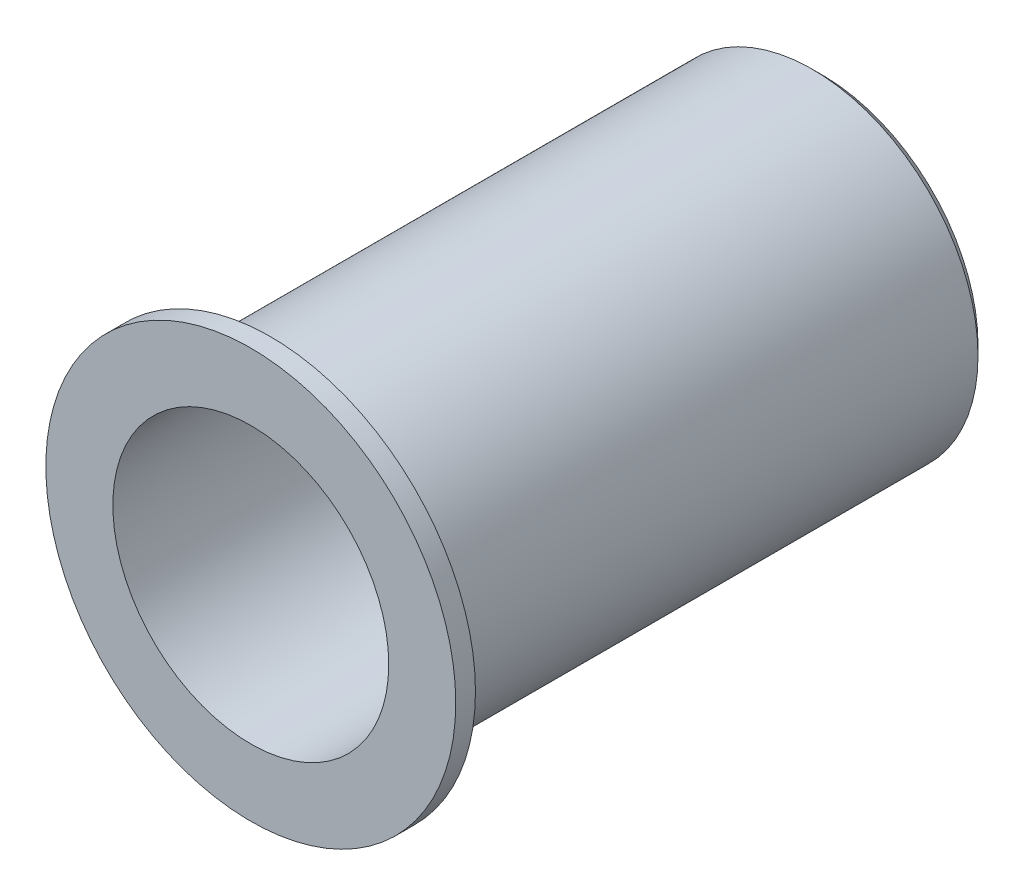
ISO-10303-21;
HEADER;
FILE_DESCRIPTION(('STEP AP214'),'2;1');
FILE_NAME('part.step','',(''),(''),'','','');
FILE_SCHEMA(('AUTOMOTIVE_DESIGN { 1 0 10303 214 1 1 1 1 }'));
ENDSEC;
DATA;
#1=APPLICATION_CONTEXT('core data for automotive mechanical design processes');
#2=APPLICATION_PROTOCOL_DEFINITION('international standard','automotive_design',2000,#1);
#3=PRODUCT_CONTEXT('',#1,'mechanical');
#4=PRODUCT('Part','Part','',(#3));
#5=PRODUCT_RELATED_PRODUCT_CATEGORY('part','',(#4));
#6=PRODUCT_DEFINITION_FORMATION('','',#4);
#7=PRODUCT_DEFINITION_CONTEXT('part definition',#1,'design');
#8=PRODUCT_DEFINITION('design','',#6,#7);
#9=PRODUCT_DEFINITION_SHAPE('','',#8);
#10=(LENGTH_UNIT() NAMED_UNIT(*) SI_UNIT(.MILLI.,.METRE.));
#11=(NAMED_UNIT(*) PLANE_ANGLE_UNIT() SI_UNIT($,.RADIAN.));
#12=(NAMED_UNIT(*) SI_UNIT($,.STERADIAN.) SOLID_ANGLE_UNIT());
#13=UNCERTAINTY_MEASURE_WITH_UNIT(LENGTH_MEASURE(1.E-05),#10,'distance_accuracy_value','');
#14=(GEOMETRIC_REPRESENTATION_CONTEXT(3) GLOBAL_UNCERTAINTY_ASSIGNED_CONTEXT((#13)) GLOBAL_UNIT_ASSIGNED_CONTEXT((#10,
#11,#12)) REPRESENTATION_CONTEXT('',''));
#15=CARTESIAN_POINT('',(0.,0.,0.));
#16=DIRECTION('',(0.,0.,1.));
#17=DIRECTION('',(1.,0.,0.));
#18=AXIS2_PLACEMENT_3D('',#15,#16,#17);
#19=CARTESIAN_POINT('',(0.,0.,28.));
#20=DIRECTION('',(0.,0.,-1.));
#21=DIRECTION('',(-1.,0.,0.));
#22=AXIS2_PLACEMENT_3D('',#19,#20,#21);
#23=CYLINDRICAL_SURFACE('',#22,8.4);
#24=CARTESIAN_POINT('',(0.,0.,0.499999999999997));
#25=DIRECTION('',(0.,0.,1.));
#26=DIRECTION('',(1.,0.,0.));
#27=AXIS2_PLACEMENT_3D('',#24,#25,#26);
#28=CIRCLE('',#27,8.4);
#29=CARTESIAN_POINT('',(8.4,0.,0.499999999999997));
#30=VERTEX_POINT('',#29);
#31=EDGE_CURVE('E48',#30,#30,#28,.T.);
#32=ORIENTED_EDGE('',*,*,#31,.T.);
#33=EDGE_LOOP('',(#32));
#34=FACE_BOUND('',#33,.T.);
#35=CARTESIAN_POINT('',(0.,0.,28.));
#36=DIRECTION('',(0.,0.,1.));
#37=DIRECTION('',(1.,0.,0.));
#38=AXIS2_PLACEMENT_3D('',#35,#36,#37);
#39=CIRCLE('',#38,8.4);
#40=CARTESIAN_POINT('',(8.4,0.,28.));
#41=VERTEX_POINT('',#40);
#42=EDGE_CURVE('E52',#41,#41,#39,.T.);
#43=ORIENTED_EDGE('',*,*,#42,.F.);
#44=EDGE_LOOP('',(#43));
#45=FACE_BOUND('',#44,.T.);
#46=ADVANCED_FACE('F40',(#34,#45),#23,.T.);
#47=CARTESIAN_POINT('',(0.,0.,0.));
#48=DIRECTION('',(0.,0.,1.));
#49=DIRECTION('',(1.,0.,0.));
#50=AXIS2_PLACEMENT_3D('',#47,#48,#49);
#51=PLANE('',#50);
#52=CARTESIAN_POINT('',(0.,0.,0.));
#53=DIRECTION('',(0.,0.,1.));
#54=DIRECTION('',(1.,0.,0.));
#55=AXIS2_PLACEMENT_3D('',#52,#53,#54);
#56=CIRCLE('',#55,7.9);
#57=CARTESIAN_POINT('',(7.9,0.,0.));
#58=VERTEX_POINT('',#57);
#59=EDGE_CURVE('E10',#58,#58,#56,.F.);
#60=ORIENTED_EDGE('',*,*,#59,.T.);
#61=EDGE_LOOP('',(#60));
#62=FACE_BOUND('',#61,.T.);
#63=CARTESIAN_POINT('',(0.,5.,0.));
#64=DIRECTION('',(0.,0.,-1.));
#65=DIRECTION('',(-1.,0.,0.));
#66=AXIS2_PLACEMENT_3D('',#63,#64,#65);
#67=CIRCLE('',#66,1.65);
#68=CARTESIAN_POINT('',(-1.65,5.,0.));
#69=VERTEX_POINT('',#68);
#70=EDGE_CURVE('E63',#69,#69,#67,.T.);
#71=ORIENTED_EDGE('',*,*,#70,.F.);
#72=EDGE_LOOP('',(#71));
#73=FACE_BOUND('',#72,.T.);
#74=CARTESIAN_POINT('',(0.,0.,0.));
#75=DIRECTION('',(0.,0.,-1.));
#76=DIRECTION('',(-1.,0.,0.));
#77=AXIS2_PLACEMENT_3D('',#74,#75,#76);
#78=CIRCLE('',#77,1.65);
#79=CARTESIAN_POINT('',(-1.65,0.,0.));
#80=VERTEX_POINT('',#79);
#81=EDGE_CURVE('E62',#80,#80,#78,.T.);
#82=ORIENTED_EDGE('',*,*,#81,.F.);
#83=EDGE_LOOP('',(#82));
#84=FACE_BOUND('',#83,.T.);
#85=CARTESIAN_POINT('',(4.33012701892166,-2.50000000000031,0.));
#86=DIRECTION('',(0.,0.,-1.));
#87=DIRECTION('',(-1.,0.,0.));
#88=AXIS2_PLACEMENT_3D('',#85,#86,#87);
#89=CIRCLE('',#88,1.65);
#90=CARTESIAN_POINT('',(2.68012701892166,-2.50000000000031,0.));
#91=VERTEX_POINT('',#90);
#92=EDGE_CURVE('E67',#91,#91,#89,.T.);
#93=ORIENTED_EDGE('',*,*,#92,.F.);
#94=EDGE_LOOP('',(#93));
#95=FACE_BOUND('',#94,.T.);
#96=CARTESIAN_POINT('',(-4.33012701892272,-2.49999999999969,0.));
#97=DIRECTION('',(0.,0.,-1.));
#98=DIRECTION('',(-1.,0.,0.));
#99=AXIS2_PLACEMENT_3D('',#96,#97,#98);
#100=CIRCLE('',#99,1.65);
#101=CARTESIAN_POINT('',(-5.98012701892272,-2.49999999999969,0.));
#102=VERTEX_POINT('',#101);
#103=EDGE_CURVE('E71',#102,#102,#100,.T.);
#104=ORIENTED_EDGE('',*,*,#103,.F.);
#105=EDGE_LOOP('',(#104));
#106=FACE_BOUND('',#105,.T.);
#107=ADVANCED_FACE('F116',(#62,#73,#84,#95,#106),#51,.F.);
#108=CARTESIAN_POINT('',(0.,0.,5.));
#109=DIRECTION('',(0.,0.,1.));
#110=DIRECTION('',(1.,0.,0.));
#111=AXIS2_PLACEMENT_3D('',#108,#109,#110);
#112=CYLINDRICAL_SURFACE('',#111,7.);
#113=CARTESIAN_POINT('',(0.,0.,5.));
#114=DIRECTION('',(0.,0.,1.));
#115=DIRECTION('',(1.,0.,0.));
#116=AXIS2_PLACEMENT_3D('',#113,#114,#115);
#117=CIRCLE('',#116,7.);
#118=CARTESIAN_POINT('',(7.,0.,5.));
#119=VERTEX_POINT('',#118);
#120=EDGE_CURVE('E56',#119,#119,#117,.T.);
#121=ORIENTED_EDGE('',*,*,#120,.F.);
#122=EDGE_LOOP('',(#121));
#123=FACE_BOUND('',#122,.T.);
#124=CARTESIAN_POINT('',(0.,0.,29.));
#125=DIRECTION('',(0.,0.,1.));
#126=DIRECTION('',(1.,0.,0.));
#127=AXIS2_PLACEMENT_3D('',#124,#125,#126);
#128=CIRCLE('',#127,7.);
#129=CARTESIAN_POINT('',(7.,0.,29.));
#130=VERTEX_POINT('',#129);
#131=EDGE_CURVE('E85',#130,#130,#128,.F.);
#132=ORIENTED_EDGE('',*,*,#131,.F.);
#133=EDGE_LOOP('',(#132));
#134=FACE_BOUND('',#133,.T.);
#135=ADVANCED_FACE('F120',(#123,#134),#112,.F.);
#136=CARTESIAN_POINT('',(0.,0.,5.));
#137=DIRECTION('',(0.,0.,1.));
#138=DIRECTION('',(1.,0.,0.));
#139=AXIS2_PLACEMENT_3D('',#136,#137,#138);
#140=PLANE('',#139);
#141=CARTESIAN_POINT('',(0.,5.,5.));
#142=DIRECTION('',(0.,0.,1.));
#143=DIRECTION('',(1.,0.,0.));
#144=AXIS2_PLACEMENT_3D('',#141,#142,#143);
#145=CIRCLE('',#144,1.65);
#146=CARTESIAN_POINT('',(1.65,5.,5.));
#147=VERTEX_POINT('',#146);
#148=EDGE_CURVE('E59',#147,#147,#145,.T.);
#149=ORIENTED_EDGE('',*,*,#148,.F.);
#150=EDGE_LOOP('',(#149));
#151=FACE_BOUND('',#150,.T.);
#152=CARTESIAN_POINT('',(0.,0.,5.));
#153=DIRECTION('',(0.,0.,1.));
#154=DIRECTION('',(1.,0.,0.));
#155=AXIS2_PLACEMENT_3D('',#152,#153,#154);
#156=CIRCLE('',#155,1.65);
#157=CARTESIAN_POINT('',(1.65,0.,5.));
#158=VERTEX_POINT('',#157);
#159=EDGE_CURVE('E64',#158,#158,#156,.T.);
#160=ORIENTED_EDGE('',*,*,#159,.F.);
#161=EDGE_LOOP('',(#160));
#162=FACE_BOUND('',#161,.T.);
#163=CARTESIAN_POINT('',(4.33012701892166,-2.50000000000031,5.));
#164=DIRECTION('',(0.,0.,1.));
#165=DIRECTION('',(1.,0.,0.));
#166=AXIS2_PLACEMENT_3D('',#163,#164,#165);
#167=CIRCLE('',#166,1.65);
#168=CARTESIAN_POINT('',(5.98012701892166,-2.50000000000031,5.));
#169=VERTEX_POINT('',#168);
#170=EDGE_CURVE('E68',#169,#169,#167,.T.);
#171=ORIENTED_EDGE('',*,*,#170,.F.);
#172=EDGE_LOOP('',(#171));
#173=FACE_BOUND('',#172,.T.);
#174=CARTESIAN_POINT('',(-4.33012701892272,-2.49999999999969,5.));
#175=DIRECTION('',(0.,0.,1.));
#176=DIRECTION('',(1.,0.,0.));
#177=AXIS2_PLACEMENT_3D('',#174,#175,#176);
#178=CIRCLE('',#177,1.65);
#179=CARTESIAN_POINT('',(-2.68012701892273,-2.49999999999969,5.));
#180=VERTEX_POINT('',#179);
#181=EDGE_CURVE('E72',#180,#180,#178,.T.);
#182=ORIENTED_EDGE('',*,*,#181,.F.);
#183=EDGE_LOOP('',(#182));
#184=FACE_BOUND('',#183,.T.);
#185=ORIENTED_EDGE('',*,*,#120,.T.);
#186=EDGE_LOOP('',(#185));
#187=FACE_BOUND('',#186,.T.);
#188=ADVANCED_FACE('F126',(#151,#162,#173,#184,#187),#140,.T.);
#189=CARTESIAN_POINT('',(-4.33012701892272,-2.49999999999969,0.));
#190=DIRECTION('',(0.,0.,-1.));
#191=DIRECTION('',(-1.,0.,0.));
#192=AXIS2_PLACEMENT_3D('',#189,#190,#191);
#193=CYLINDRICAL_SURFACE('',#192,1.65);
#194=ORIENTED_EDGE('',*,*,#181,.T.);
#195=EDGE_LOOP('',(#194));
#196=FACE_BOUND('',#195,.T.);
#197=ORIENTED_EDGE('',*,*,#103,.T.);
#198=EDGE_LOOP('',(#197));
#199=FACE_BOUND('',#198,.T.);
#200=ADVANCED_FACE('F130',(#196,#199),#193,.F.);
#201=CARTESIAN_POINT('',(4.33012701892166,-2.50000000000031,0.));
#202=DIRECTION('',(0.,0.,-1.));
#203=DIRECTION('',(-1.,0.,0.));
#204=AXIS2_PLACEMENT_3D('',#201,#202,#203);
#205=CYLINDRICAL_SURFACE('',#204,1.65);
#206=ORIENTED_EDGE('',*,*,#170,.T.);
#207=EDGE_LOOP('',(#206));
#208=FACE_BOUND('',#207,.T.);
#209=ORIENTED_EDGE('',*,*,#92,.T.);
#210=EDGE_LOOP('',(#209));
#211=FACE_BOUND('',#210,.T.);
#212=ADVANCED_FACE('F134',(#208,#211),#205,.F.);
#213=CARTESIAN_POINT('',(0.,0.,0.));
#214=DIRECTION('',(0.,0.,-1.));
#215=DIRECTION('',(-1.,0.,0.));
#216=AXIS2_PLACEMENT_3D('',#213,#214,#215);
#217=CYLINDRICAL_SURFACE('',#216,1.65);
#218=ORIENTED_EDGE('',*,*,#159,.T.);
#219=EDGE_LOOP('',(#218));
#220=FACE_BOUND('',#219,.T.);
#221=ORIENTED_EDGE('',*,*,#81,.T.);
#222=EDGE_LOOP('',(#221));
#223=FACE_BOUND('',#222,.T.);
#224=ADVANCED_FACE('F138',(#220,#223),#217,.F.);
#225=CARTESIAN_POINT('',(0.,5.,0.));
#226=DIRECTION('',(0.,0.,-1.));
#227=DIRECTION('',(-1.,0.,0.));
#228=AXIS2_PLACEMENT_3D('',#225,#226,#227);
#229=CYLINDRICAL_SURFACE('',#228,1.65);
#230=ORIENTED_EDGE('',*,*,#148,.T.);
#231=EDGE_LOOP('',(#230));
#232=FACE_BOUND('',#231,.T.);
#233=ORIENTED_EDGE('',*,*,#70,.T.);
#234=EDGE_LOOP('',(#233));
#235=FACE_BOUND('',#234,.T.);
#236=ADVANCED_FACE('F101',(#232,#235),#229,.F.);
#237=CARTESIAN_POINT('',(0.,0.,29.));
#238=DIRECTION('',(0.,0.,-1.));
#239=DIRECTION('',(-1.,0.,0.));
#240=AXIS2_PLACEMENT_3D('',#237,#238,#239);
#241=CYLINDRICAL_SURFACE('',#240,10.4);
#242=CARTESIAN_POINT('',(0.,0.,29.));
#243=DIRECTION('',(0.,0.,1.));
#244=DIRECTION('',(1.,0.,0.));
#245=AXIS2_PLACEMENT_3D('',#242,#243,#244);
#246=CIRCLE('',#245,10.4);
#247=CARTESIAN_POINT('',(10.4,0.,29.));
#248=VERTEX_POINT('',#247);
#249=EDGE_CURVE('E89',#248,#248,#246,.T.);
#250=ORIENTED_EDGE('',*,*,#249,.F.);
#251=EDGE_LOOP('',(#250));
#252=FACE_BOUND('',#251,.T.);
#253=CARTESIAN_POINT('',(0.,0.,28.));
#254=DIRECTION('',(0.,0.,1.));
#255=DIRECTION('',(1.,0.,0.));
#256=AXIS2_PLACEMENT_3D('',#253,#254,#255);
#257=CIRCLE('',#256,10.4);
#258=CARTESIAN_POINT('',(10.4,0.,28.));
#259=VERTEX_POINT('',#258);
#260=EDGE_CURVE('E86',#259,#259,#257,.T.);
#261=ORIENTED_EDGE('',*,*,#260,.T.);
#262=EDGE_LOOP('',(#261));
#263=FACE_BOUND('',#262,.T.);
#264=ADVANCED_FACE('F98',(#252,#263),#241,.T.);
#265=CARTESIAN_POINT('',(0.,0.,29.));
#266=DIRECTION('',(0.,0.,1.));
#267=DIRECTION('',(1.,0.,0.));
#268=AXIS2_PLACEMENT_3D('',#265,#266,#267);
#269=PLANE('',#268);
#270=ORIENTED_EDGE('',*,*,#249,.T.);
#271=EDGE_LOOP('',(#270));
#272=FACE_BOUND('',#271,.T.);
#273=ORIENTED_EDGE('',*,*,#131,.T.);
#274=EDGE_LOOP('',(#273));
#275=FACE_BOUND('',#274,.T.);
#276=ADVANCED_FACE('F95',(#272,#275),#269,.T.);
#277=CARTESIAN_POINT('',(0.,0.,28.));
#278=DIRECTION('',(0.,0.,1.));
#279=DIRECTION('',(1.,0.,0.));
#280=AXIS2_PLACEMENT_3D('',#277,#278,#279);
#281=PLANE('',#280);
#282=ORIENTED_EDGE('',*,*,#42,.T.);
#283=EDGE_LOOP('',(#282));
#284=FACE_BOUND('',#283,.T.);
#285=ORIENTED_EDGE('',*,*,#260,.F.);
#286=EDGE_LOOP('',(#285));
#287=FACE_BOUND('',#286,.T.);
#288=ADVANCED_FACE('F105',(#284,#287),#281,.F.);
#289=CARTESIAN_POINT('',(0.,0.,0.499999999999997));
#290=DIRECTION('',(0.,0.,1.));
#291=DIRECTION('',(1.,0.,0.));
#292=AXIS2_PLACEMENT_3D('',#289,#290,#291);
#293=CONICAL_SURFACE('',#292,8.4,0.785398163397452);
#294=ORIENTED_EDGE('',*,*,#59,.F.);
#295=EDGE_LOOP('',(#294));
#296=FACE_BOUND('',#295,.T.);
#297=ORIENTED_EDGE('',*,*,#31,.F.);
#298=EDGE_LOOP('',(#297));
#299=FACE_BOUND('',#298,.T.);
#300=ADVANCED_FACE('F43',(#296,#299),#293,.T.);
#301=CLOSED_SHELL('',(#46,#107,#135,#188,#200,#212,#224,#236,#264,#276,#288,#300));
#302=MANIFOLD_SOLID_BREP('B2',#301);
#303=ADVANCED_BREP_SHAPE_REPRESENTATION('',(#18,#302),#14);
#304=SHAPE_DEFINITION_REPRESENTATION(#9,#303);
ENDSEC;
END-ISO-10303-21;
